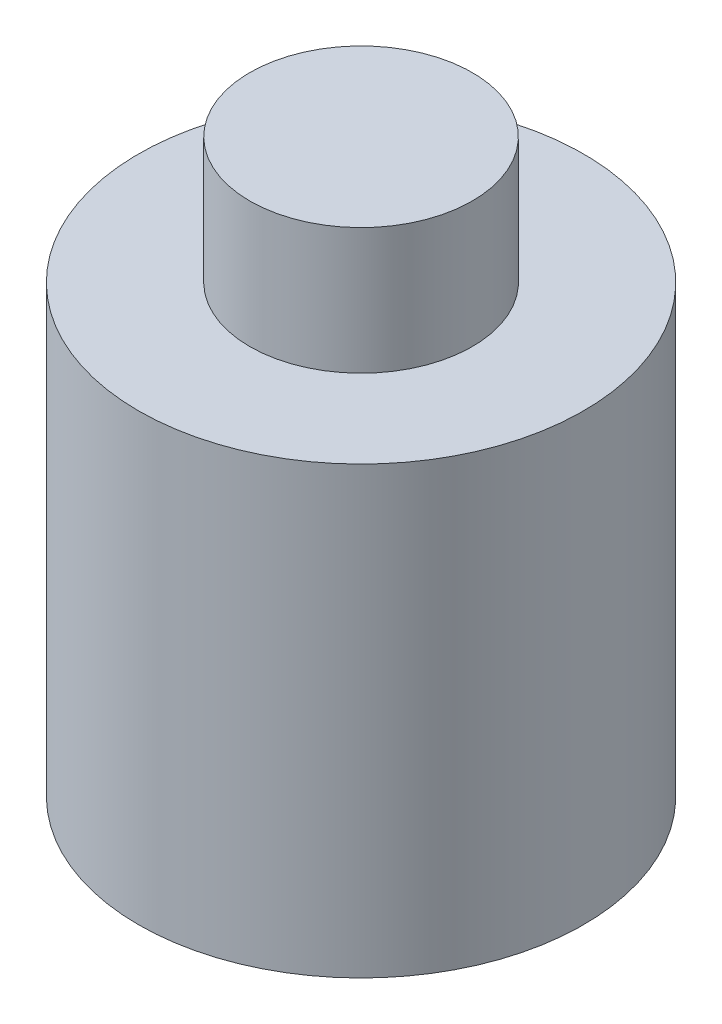
ISO-10303-21;
HEADER;
FILE_DESCRIPTION(('STEP AP214'),'2;1');
FILE_NAME('part.step','',(''),(''),'','','');
FILE_SCHEMA(('AUTOMOTIVE_DESIGN { 1 0 10303 214 1 1 1 1 }'));
ENDSEC;
DATA;
#1=APPLICATION_CONTEXT('core data for automotive mechanical design processes');
#2=APPLICATION_PROTOCOL_DEFINITION('international standard','automotive_design',2000,#1);
#3=PRODUCT_CONTEXT('',#1,'mechanical');
#4=PRODUCT('Part','Part','',(#3));
#5=PRODUCT_RELATED_PRODUCT_CATEGORY('part','',(#4));
#6=PRODUCT_DEFINITION_FORMATION('','',#4);
#7=PRODUCT_DEFINITION_CONTEXT('part definition',#1,'design');
#8=PRODUCT_DEFINITION('design','',#6,#7);
#9=PRODUCT_DEFINITION_SHAPE('','',#8);
#10=(LENGTH_UNIT() NAMED_UNIT(*) SI_UNIT(.MILLI.,.METRE.));
#11=(NAMED_UNIT(*) PLANE_ANGLE_UNIT() SI_UNIT($,.RADIAN.));
#12=(NAMED_UNIT(*) SI_UNIT($,.STERADIAN.) SOLID_ANGLE_UNIT());
#13=UNCERTAINTY_MEASURE_WITH_UNIT(LENGTH_MEASURE(1.E-05),#10,'distance_accuracy_value','');
#14=(GEOMETRIC_REPRESENTATION_CONTEXT(3) GLOBAL_UNCERTAINTY_ASSIGNED_CONTEXT((#13)) GLOBAL_UNIT_ASSIGNED_CONTEXT((#10,
#11,#12)) REPRESENTATION_CONTEXT('',''));
#15=CARTESIAN_POINT('',(0.,0.,0.));
#16=DIRECTION('',(0.,0.,1.));
#17=DIRECTION('',(1.,0.,0.));
#18=AXIS2_PLACEMENT_3D('',#15,#16,#17);
#19=CARTESIAN_POINT('',(0.,6.,0.));
#20=DIRECTION('',(0.,1.,0.));
#21=DIRECTION('',(0.,0.,1.));
#22=AXIS2_PLACEMENT_3D('',#19,#20,#21);
#23=PLANE('',#22);
#24=CARTESIAN_POINT('',(0.,6.,0.));
#25=DIRECTION('',(0.,1.,0.));
#26=DIRECTION('',(0.,0.,1.));
#27=AXIS2_PLACEMENT_3D('',#24,#25,#26);
#28=CIRCLE('',#27,1.5);
#29=CARTESIAN_POINT('',(0.,6.,1.5));
#30=VERTEX_POINT('',#29);
#31=EDGE_CURVE('E51',#30,#30,#28,.T.);
#32=ORIENTED_EDGE('',*,*,#31,.F.);
#33=EDGE_LOOP('',(#32));
#34=FACE_BOUND('',#33,.T.);
#35=CARTESIAN_POINT('',(0.,6.,0.));
#36=DIRECTION('',(0.,1.,0.));
#37=DIRECTION('',(0.,0.,1.));
#38=AXIS2_PLACEMENT_3D('',#35,#36,#37);
#39=CIRCLE('',#38,3.);
#40=CARTESIAN_POINT('',(0.,6.,3.));
#41=VERTEX_POINT('',#40);
#42=EDGE_CURVE('E10',#41,#41,#39,.T.);
#43=ORIENTED_EDGE('',*,*,#42,.T.);
#44=EDGE_LOOP('',(#43));
#45=FACE_BOUND('',#44,.T.);
#46=ADVANCED_FACE('F32',(#34,#45),#23,.T.);
#47=CARTESIAN_POINT('',(0.,0.,0.));
#48=DIRECTION('',(0.,1.,0.));
#49=DIRECTION('',(0.,0.,1.));
#50=AXIS2_PLACEMENT_3D('',#47,#48,#49);
#51=PLANE('',#50);
#52=CARTESIAN_POINT('',(0.,0.,0.));
#53=DIRECTION('',(0.,1.,0.));
#54=DIRECTION('',(0.,0.,1.));
#55=AXIS2_PLACEMENT_3D('',#52,#53,#54);
#56=CIRCLE('',#55,3.);
#57=CARTESIAN_POINT('',(0.,0.,3.));
#58=VERTEX_POINT('',#57);
#59=EDGE_CURVE('E36',#58,#58,#56,.T.);
#60=ORIENTED_EDGE('',*,*,#59,.F.);
#61=EDGE_LOOP('',(#60));
#62=FACE_BOUND('',#61,.T.);
#63=CARTESIAN_POINT('',(0.,0.,0.));
#64=DIRECTION('',(0.,1.,0.));
#65=DIRECTION('',(0.,0.,1.));
#66=AXIS2_PLACEMENT_3D('',#63,#64,#65);
#67=CIRCLE('',#66,1.);
#68=CARTESIAN_POINT('',(0.,0.,1.));
#69=VERTEX_POINT('',#68);
#70=EDGE_CURVE('E43',#69,#69,#67,.T.);
#71=ORIENTED_EDGE('',*,*,#70,.T.);
#72=EDGE_LOOP('',(#71));
#73=FACE_BOUND('',#72,.T.);
#74=ADVANCED_FACE('F67',(#62,#73),#51,.F.);
#75=CARTESIAN_POINT('',(0.,6.,0.));
#76=DIRECTION('',(0.,-1.,0.));
#77=DIRECTION('',(0.,0.,-1.));
#78=AXIS2_PLACEMENT_3D('',#75,#76,#77);
#79=CYLINDRICAL_SURFACE('',#78,3.);
#80=ORIENTED_EDGE('',*,*,#42,.F.);
#81=EDGE_LOOP('',(#80));
#82=FACE_BOUND('',#81,.T.);
#83=ORIENTED_EDGE('',*,*,#59,.T.);
#84=EDGE_LOOP('',(#83));
#85=FACE_BOUND('',#84,.T.);
#86=ADVANCED_FACE('F34',(#82,#85),#79,.T.);
#87=CARTESIAN_POINT('',(0.,6.,0.));
#88=DIRECTION('',(0.,-1.,0.));
#89=DIRECTION('',(0.,0.,-1.));
#90=AXIS2_PLACEMENT_3D('',#87,#88,#89);
#91=CYLINDRICAL_SURFACE('',#90,1.);
#92=CARTESIAN_POINT('',(0.,6.,0.));
#93=DIRECTION('',(0.,1.,0.));
#94=DIRECTION('',(0.,0.,1.));
#95=AXIS2_PLACEMENT_3D('',#92,#93,#94);
#96=CIRCLE('',#95,1.);
#97=CARTESIAN_POINT('',(0.,6.,1.));
#98=VERTEX_POINT('',#97);
#99=EDGE_CURVE('E47',#98,#98,#96,.T.);
#100=ORIENTED_EDGE('',*,*,#99,.T.);
#101=EDGE_LOOP('',(#100));
#102=FACE_BOUND('',#101,.T.);
#103=ORIENTED_EDGE('',*,*,#70,.F.);
#104=EDGE_LOOP('',(#103));
#105=FACE_BOUND('',#104,.T.);
#106=ADVANCED_FACE('F74',(#102,#105),#91,.F.);
#107=CARTESIAN_POINT('',(0.,6.,0.));
#108=DIRECTION('',(0.,1.,0.));
#109=DIRECTION('',(0.,0.,1.));
#110=AXIS2_PLACEMENT_3D('',#107,#108,#109);
#111=PLANE('',#110);
#112=ORIENTED_EDGE('',*,*,#99,.F.);
#113=EDGE_LOOP('',(#112));
#114=FACE_BOUND('',#113,.T.);
#115=ADVANCED_FACE('F62',(#114),#111,.F.);
#116=CARTESIAN_POINT('',(0.,7.7,0.));
#117=DIRECTION('',(0.,-1.,0.));
#118=DIRECTION('',(0.,0.,-1.));
#119=AXIS2_PLACEMENT_3D('',#116,#117,#118);
#120=CYLINDRICAL_SURFACE('',#119,1.5);
#121=CARTESIAN_POINT('',(0.,7.7,0.));
#122=DIRECTION('',(0.,1.,0.));
#123=DIRECTION('',(0.,0.,1.));
#124=AXIS2_PLACEMENT_3D('',#121,#122,#123);
#125=CIRCLE('',#124,1.5);
#126=CARTESIAN_POINT('',(0.,7.7,1.5));
#127=VERTEX_POINT('',#126);
#128=EDGE_CURVE('E50',#127,#127,#125,.T.);
#129=ORIENTED_EDGE('',*,*,#128,.F.);
#130=EDGE_LOOP('',(#129));
#131=FACE_BOUND('',#130,.T.);
#132=ORIENTED_EDGE('',*,*,#31,.T.);
#133=EDGE_LOOP('',(#132));
#134=FACE_BOUND('',#133,.T.);
#135=ADVANCED_FACE('F59',(#131,#134),#120,.T.);
#136=CARTESIAN_POINT('',(0.,7.7,0.));
#137=DIRECTION('',(0.,1.,0.));
#138=DIRECTION('',(0.,0.,1.));
#139=AXIS2_PLACEMENT_3D('',#136,#137,#138);
#140=PLANE('',#139);
#141=ORIENTED_EDGE('',*,*,#128,.T.);
#142=EDGE_LOOP('',(#141));
#143=FACE_BOUND('',#142,.T.);
#144=ADVANCED_FACE('F57',(#143),#140,.T.);
#145=CLOSED_SHELL('',(#46,#74,#86,#106,#115,#135,#144));
#146=MANIFOLD_SOLID_BREP('B2',#145);
#147=ADVANCED_BREP_SHAPE_REPRESENTATION('',(#18,#146),#14);
#148=SHAPE_DEFINITION_REPRESENTATION(#9,#147);
ENDSEC;
END-ISO-10303-21;
